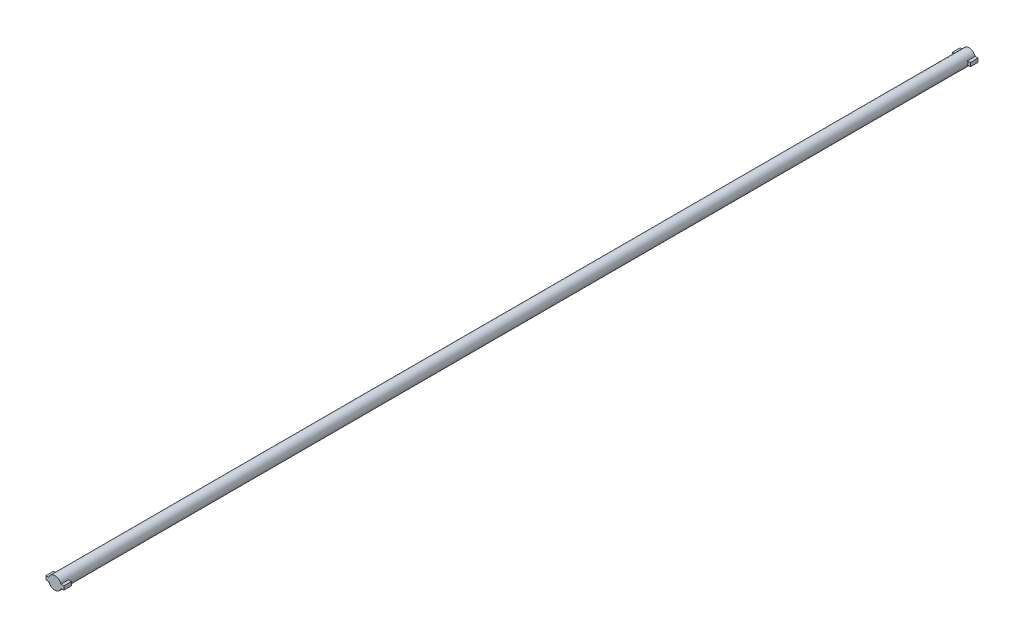
ISO-10303-21;
HEADER;
FILE_DESCRIPTION(('STEP AP214'),'2;1');
FILE_NAME('part.step','',(''),(''),'','','');
FILE_SCHEMA(('AUTOMOTIVE_DESIGN { 1 0 10303 214 1 1 1 1 }'));
ENDSEC;
DATA;
#1=APPLICATION_CONTEXT('core data for automotive mechanical design processes');
#2=APPLICATION_PROTOCOL_DEFINITION('international standard','automotive_design',2000,#1);
#3=PRODUCT_CONTEXT('',#1,'mechanical');
#4=PRODUCT('Part','Part','',(#3));
#5=PRODUCT_RELATED_PRODUCT_CATEGORY('part','',(#4));
#6=PRODUCT_DEFINITION_FORMATION('','',#4);
#7=PRODUCT_DEFINITION_CONTEXT('part definition',#1,'design');
#8=PRODUCT_DEFINITION('design','',#6,#7);
#9=PRODUCT_DEFINITION_SHAPE('','',#8);
#10=(LENGTH_UNIT() NAMED_UNIT(*) SI_UNIT(.MILLI.,.METRE.));
#11=(NAMED_UNIT(*) PLANE_ANGLE_UNIT() SI_UNIT($,.RADIAN.));
#12=(NAMED_UNIT(*) SI_UNIT($,.STERADIAN.) SOLID_ANGLE_UNIT());
#13=UNCERTAINTY_MEASURE_WITH_UNIT(LENGTH_MEASURE(1.E-05),#10,'distance_accuracy_value','');
#14=(GEOMETRIC_REPRESENTATION_CONTEXT(3) GLOBAL_UNCERTAINTY_ASSIGNED_CONTEXT((#13)) GLOBAL_UNIT_ASSIGNED_CONTEXT((#10,
#11,#12)) REPRESENTATION_CONTEXT('',''));
#15=CARTESIAN_POINT('',(0.,0.,0.));
#16=DIRECTION('',(0.,0.,1.));
#17=DIRECTION('',(1.,0.,0.));
#18=AXIS2_PLACEMENT_3D('',#15,#16,#17);
#19=CARTESIAN_POINT('',(0.,0.,457.2));
#20=DIRECTION('',(0.,0.,-1.));
#21=DIRECTION('',(-1.,0.,0.));
#22=AXIS2_PLACEMENT_3D('',#19,#20,#21);
#23=CYLINDRICAL_SURFACE('',#22,3.175);
#24=CARTESIAN_POINT('',(0.,0.,457.2));
#25=DIRECTION('',(0.,0.,1.));
#26=DIRECTION('',(1.,0.,0.));
#27=AXIS2_PLACEMENT_3D('',#24,#25,#26);
#28=CIRCLE('',#27,3.175);
#29=CARTESIAN_POINT('',(-3.0287569644988,-0.9525,457.2));
#30=VERTEX_POINT('',#29);
#31=CARTESIAN_POINT('',(3.0287569644988,-0.9525,457.2));
#32=VERTEX_POINT('',#31);
#33=EDGE_CURVE('E41',#30,#32,#28,.T.);
#34=ORIENTED_EDGE('',*,*,#33,.F.);
#35=DIRECTION('',(0.,0.,1.));
#36=VECTOR('',#35,1.);
#37=CARTESIAN_POINT('',(-3.0287569644988,-0.9525,453.39));
#38=LINE('',#37,#36);
#39=CARTESIAN_POINT('',(-3.0287569644988,-0.9525,453.39));
#40=VERTEX_POINT('',#39);
#41=EDGE_CURVE('E226',#40,#30,#38,.T.);
#42=ORIENTED_EDGE('',*,*,#41,.F.);
#43=CARTESIAN_POINT('',(0.,0.,453.39));
#44=DIRECTION('',(0.,0.,-1.));
#45=DIRECTION('',(-1.,0.,0.));
#46=AXIS2_PLACEMENT_3D('',#43,#44,#45);
#47=CIRCLE('',#46,3.175);
#48=CARTESIAN_POINT('',(-3.0287569644988,0.9525,453.39));
#49=VERTEX_POINT('',#48);
#50=EDGE_CURVE('E216',#40,#49,#47,.T.);
#51=ORIENTED_EDGE('',*,*,#50,.T.);
#52=DIRECTION('',(0.,0.,1.));
#53=VECTOR('',#52,1.);
#54=CARTESIAN_POINT('',(-3.0287569644988,0.9525,453.39));
#55=LINE('',#54,#53);
#56=CARTESIAN_POINT('',(-3.0287569644988,0.9525,457.2));
#57=VERTEX_POINT('',#56);
#58=EDGE_CURVE('E238',#49,#57,#55,.T.);
#59=ORIENTED_EDGE('',*,*,#58,.T.);
#60=CARTESIAN_POINT('',(3.0287569644988,0.9525,457.2));
#61=VERTEX_POINT('',#60);
#62=EDGE_CURVE('E11',#61,#57,#28,.T.);
#63=ORIENTED_EDGE('',*,*,#62,.F.);
#64=DIRECTION('',(0.,0.,1.));
#65=VECTOR('',#64,1.);
#66=CARTESIAN_POINT('',(3.0287569644988,0.9525,453.39));
#67=LINE('',#66,#65);
#68=CARTESIAN_POINT('',(3.0287569644988,0.9525,453.39));
#69=VERTEX_POINT('',#68);
#70=EDGE_CURVE('E256',#69,#61,#67,.T.);
#71=ORIENTED_EDGE('',*,*,#70,.F.);
#72=CARTESIAN_POINT('',(0.,0.,453.39));
#73=DIRECTION('',(0.,0.,-1.));
#74=DIRECTION('',(1.,0.,0.));
#75=AXIS2_PLACEMENT_3D('',#72,#73,#74);
#76=CIRCLE('',#75,3.175);
#77=CARTESIAN_POINT('',(3.0287569644988,-0.9525,453.39));
#78=VERTEX_POINT('',#77);
#79=EDGE_CURVE('E246',#69,#78,#76,.T.);
#80=ORIENTED_EDGE('',*,*,#79,.T.);
#81=DIRECTION('',(0.,0.,1.));
#82=VECTOR('',#81,1.);
#83=CARTESIAN_POINT('',(3.0287569644988,-0.9525,453.39));
#84=LINE('',#83,#82);
#85=EDGE_CURVE('E266',#78,#32,#84,.T.);
#86=ORIENTED_EDGE('',*,*,#85,.T.);
#87=EDGE_LOOP('',(#34,#42,#51,#59,#63,#71,#80,#86));
#88=FACE_BOUND('',#87,.T.);
#89=CARTESIAN_POINT('',(0.,0.,3.80999999999998));
#90=DIRECTION('',(0.,0.,-1.));
#91=DIRECTION('',(-1.,0.,0.));
#92=AXIS2_PLACEMENT_3D('',#89,#90,#91);
#93=CIRCLE('',#92,3.175);
#94=CARTESIAN_POINT('',(-3.0287569644988,-0.9525,3.80999999999998));
#95=VERTEX_POINT('',#94);
#96=CARTESIAN_POINT('',(-3.0287569644988,0.9525,3.80999999999998));
#97=VERTEX_POINT('',#96);
#98=EDGE_CURVE('E48',#95,#97,#93,.T.);
#99=ORIENTED_EDGE('',*,*,#98,.F.);
#100=DIRECTION('',(0.,0.,1.));
#101=VECTOR('',#100,1.);
#102=CARTESIAN_POINT('',(-3.0287569644988,-0.9525,0.));
#103=LINE('',#102,#101);
#104=CARTESIAN_POINT('',(-3.0287569644988,-0.9525,0.));
#105=VERTEX_POINT('',#104);
#106=EDGE_CURVE('E157',#105,#95,#103,.T.);
#107=ORIENTED_EDGE('',*,*,#106,.F.);
#108=CARTESIAN_POINT('',(0.,0.,0.));
#109=DIRECTION('',(0.,0.,1.));
#110=DIRECTION('',(1.,0.,0.));
#111=AXIS2_PLACEMENT_3D('',#108,#109,#110);
#112=CIRCLE('',#111,3.175);
#113=CARTESIAN_POINT('',(3.0287569644988,-0.9525,0.));
#114=VERTEX_POINT('',#113);
#115=EDGE_CURVE('E146',#105,#114,#112,.T.);
#116=ORIENTED_EDGE('',*,*,#115,.T.);
#117=DIRECTION('',(0.,0.,1.));
#118=VECTOR('',#117,1.);
#119=CARTESIAN_POINT('',(3.0287569644988,-0.9525,0.));
#120=LINE('',#119,#118);
#121=CARTESIAN_POINT('',(3.0287569644988,-0.9525,3.80999999999998));
#122=VERTEX_POINT('',#121);
#123=EDGE_CURVE('E209',#114,#122,#120,.T.);
#124=ORIENTED_EDGE('',*,*,#123,.T.);
#125=CARTESIAN_POINT('',(0.,0.,3.80999999999998));
#126=DIRECTION('',(0.,0.,-1.));
#127=DIRECTION('',(1.,0.,0.));
#128=AXIS2_PLACEMENT_3D('',#125,#126,#127);
#129=CIRCLE('',#128,3.175);
#130=CARTESIAN_POINT('',(3.0287569644988,0.9525,3.80999999999998));
#131=VERTEX_POINT('',#130);
#132=EDGE_CURVE('E196',#131,#122,#129,.T.);
#133=ORIENTED_EDGE('',*,*,#132,.F.);
#134=DIRECTION('',(0.,0.,1.));
#135=VECTOR('',#134,1.);
#136=CARTESIAN_POINT('',(3.0287569644988,0.9525,0.));
#137=LINE('',#136,#135);
#138=CARTESIAN_POINT('',(3.0287569644988,0.9525,0.));
#139=VERTEX_POINT('',#138);
#140=EDGE_CURVE('E193',#139,#131,#137,.T.);
#141=ORIENTED_EDGE('',*,*,#140,.F.);
#142=CARTESIAN_POINT('',(-3.0287569644988,0.9525,0.));
#143=VERTEX_POINT('',#142);
#144=EDGE_CURVE('E36',#139,#143,#112,.T.);
#145=ORIENTED_EDGE('',*,*,#144,.T.);
#146=DIRECTION('',(0.,0.,1.));
#147=VECTOR('',#146,1.);
#148=CARTESIAN_POINT('',(-3.0287569644988,0.9525,0.));
#149=LINE('',#148,#147);
#150=EDGE_CURVE('E53',#143,#97,#149,.T.);
#151=ORIENTED_EDGE('',*,*,#150,.T.);
#152=EDGE_LOOP('',(#99,#107,#116,#124,#133,#141,#145,#151));
#153=FACE_BOUND('',#152,.T.);
#154=ADVANCED_FACE('F33',(#88,#153),#23,.T.);
#155=CARTESIAN_POINT('',(0.,0.,457.2));
#156=DIRECTION('',(0.,0.,1.));
#157=DIRECTION('',(1.,0.,0.));
#158=AXIS2_PLACEMENT_3D('',#155,#156,#157);
#159=PLANE('',#158);
#160=ORIENTED_EDGE('',*,*,#62,.T.);
#161=DIRECTION('',(-1.,0.,0.));
#162=VECTOR('',#161,1.);
#163=CARTESIAN_POINT('',(-4.445,0.9525,457.2));
#164=LINE('',#163,#162);
#165=CARTESIAN_POINT('',(-4.445,0.9525,457.2));
#166=VERTEX_POINT('',#165);
#167=EDGE_CURVE('E228',#57,#166,#164,.T.);
#168=ORIENTED_EDGE('',*,*,#167,.T.);
#169=DIRECTION('',(0.,-1.,0.));
#170=VECTOR('',#169,1.);
#171=CARTESIAN_POINT('',(-4.445,-0.9525,457.2));
#172=LINE('',#171,#170);
#173=CARTESIAN_POINT('',(-4.445,-0.9525,457.2));
#174=VERTEX_POINT('',#173);
#175=EDGE_CURVE('E217',#166,#174,#172,.T.);
#176=ORIENTED_EDGE('',*,*,#175,.T.);
#177=DIRECTION('',(1.,0.,0.));
#178=VECTOR('',#177,1.);
#179=CARTESIAN_POINT('',(-4.445,-0.9525,457.2));
#180=LINE('',#179,#178);
#181=EDGE_CURVE('E206',#174,#30,#180,.T.);
#182=ORIENTED_EDGE('',*,*,#181,.T.);
#183=ORIENTED_EDGE('',*,*,#33,.T.);
#184=DIRECTION('',(1.,0.,0.));
#185=VECTOR('',#184,1.);
#186=CARTESIAN_POINT('',(4.445,-0.9525,457.2));
#187=LINE('',#186,#185);
#188=CARTESIAN_POINT('',(4.445,-0.9525,457.2));
#189=VERTEX_POINT('',#188);
#190=EDGE_CURVE('E258',#32,#189,#187,.T.);
#191=ORIENTED_EDGE('',*,*,#190,.T.);
#192=DIRECTION('',(0.,1.,0.));
#193=VECTOR('',#192,1.);
#194=CARTESIAN_POINT('',(4.445,0.9525,457.2));
#195=LINE('',#194,#193);
#196=CARTESIAN_POINT('',(4.445,0.9525,457.2));
#197=VERTEX_POINT('',#196);
#198=EDGE_CURVE('E247',#189,#197,#195,.T.);
#199=ORIENTED_EDGE('',*,*,#198,.T.);
#200=DIRECTION('',(-1.,0.,0.));
#201=VECTOR('',#200,1.);
#202=CARTESIAN_POINT('',(4.445,0.9525,457.2));
#203=LINE('',#202,#201);
#204=EDGE_CURVE('E235',#197,#61,#203,.T.);
#205=ORIENTED_EDGE('',*,*,#204,.T.);
#206=EDGE_LOOP('',(#160,#168,#176,#182,#183,#191,#199,#205));
#207=FACE_BOUND('',#206,.T.);
#208=ADVANCED_FACE('F279',(#207),#159,.T.);
#209=CARTESIAN_POINT('',(0.,0.,0.));
#210=DIRECTION('',(0.,0.,1.));
#211=DIRECTION('',(1.,0.,0.));
#212=AXIS2_PLACEMENT_3D('',#209,#210,#211);
#213=PLANE('',#212);
#214=ORIENTED_EDGE('',*,*,#144,.F.);
#215=DIRECTION('',(-1.,0.,0.));
#216=VECTOR('',#215,1.);
#217=CARTESIAN_POINT('',(4.445,0.9525,0.));
#218=LINE('',#217,#216);
#219=CARTESIAN_POINT('',(4.445,0.9525,0.));
#220=VERTEX_POINT('',#219);
#221=EDGE_CURVE('E185',#220,#139,#218,.T.);
#222=ORIENTED_EDGE('',*,*,#221,.F.);
#223=DIRECTION('',(0.,1.,0.));
#224=VECTOR('',#223,1.);
#225=CARTESIAN_POINT('',(4.445,0.9525,0.));
#226=LINE('',#225,#224);
#227=CARTESIAN_POINT('',(4.445,-0.9525,0.));
#228=VERTEX_POINT('',#227);
#229=EDGE_CURVE('E190',#228,#220,#226,.T.);
#230=ORIENTED_EDGE('',*,*,#229,.F.);
#231=DIRECTION('',(1.,0.,0.));
#232=VECTOR('',#231,1.);
#233=CARTESIAN_POINT('',(4.445,-0.9525,0.));
#234=LINE('',#233,#232);
#235=EDGE_CURVE('E154',#114,#228,#234,.T.);
#236=ORIENTED_EDGE('',*,*,#235,.F.);
#237=ORIENTED_EDGE('',*,*,#115,.F.);
#238=DIRECTION('',(1.,0.,0.));
#239=VECTOR('',#238,1.);
#240=CARTESIAN_POINT('',(-4.445,-0.9525,0.));
#241=LINE('',#240,#239);
#242=CARTESIAN_POINT('',(-4.445,-0.9525,0.));
#243=VERTEX_POINT('',#242);
#244=EDGE_CURVE('E150',#243,#105,#241,.T.);
#245=ORIENTED_EDGE('',*,*,#244,.F.);
#246=DIRECTION('',(0.,-1.,0.));
#247=VECTOR('',#246,1.);
#248=CARTESIAN_POINT('',(-4.445,-0.9525,0.));
#249=LINE('',#248,#247);
#250=CARTESIAN_POINT('',(-4.445,0.9525,0.));
#251=VERTEX_POINT('',#250);
#252=EDGE_CURVE('E161',#251,#243,#249,.T.);
#253=ORIENTED_EDGE('',*,*,#252,.F.);
#254=DIRECTION('',(-1.,0.,0.));
#255=VECTOR('',#254,1.);
#256=CARTESIAN_POINT('',(-4.445,0.9525,0.));
#257=LINE('',#256,#255);
#258=EDGE_CURVE('E165',#143,#251,#257,.T.);
#259=ORIENTED_EDGE('',*,*,#258,.F.);
#260=EDGE_LOOP('',(#214,#222,#230,#236,#237,#245,#253,#259));
#261=FACE_BOUND('',#260,.T.);
#262=ADVANCED_FACE('F147',(#261),#213,.F.);
#263=CARTESIAN_POINT('',(4.445,0.9525,453.39));
#264=DIRECTION('',(0.,1.,0.));
#265=DIRECTION('',(-1.,0.,0.));
#266=AXIS2_PLACEMENT_3D('',#263,#264,#265);
#267=PLANE('',#266);
#268=ORIENTED_EDGE('',*,*,#204,.F.);
#269=DIRECTION('',(0.,0.,1.));
#270=VECTOR('',#269,1.);
#271=CARTESIAN_POINT('',(4.445,0.9525,453.39));
#272=LINE('',#271,#270);
#273=CARTESIAN_POINT('',(4.445,0.9525,453.39));
#274=VERTEX_POINT('',#273);
#275=EDGE_CURVE('E156',#274,#197,#272,.T.);
#276=ORIENTED_EDGE('',*,*,#275,.F.);
#277=DIRECTION('',(-1.,0.,0.));
#278=VECTOR('',#277,1.);
#279=CARTESIAN_POINT('',(4.445,0.9525,453.39));
#280=LINE('',#279,#278);
#281=EDGE_CURVE('E243',#274,#69,#280,.T.);
#282=ORIENTED_EDGE('',*,*,#281,.T.);
#283=ORIENTED_EDGE('',*,*,#70,.T.);
#284=EDGE_LOOP('',(#268,#276,#282,#283));
#285=FACE_BOUND('',#284,.T.);
#286=ADVANCED_FACE('F274',(#285),#267,.T.);
#287=CARTESIAN_POINT('',(4.445,0.9525,453.39));
#288=DIRECTION('',(1.,0.,0.));
#289=DIRECTION('',(0.,0.,-1.));
#290=AXIS2_PLACEMENT_3D('',#287,#288,#289);
#291=PLANE('',#290);
#292=ORIENTED_EDGE('',*,*,#198,.F.);
#293=DIRECTION('',(0.,0.,1.));
#294=VECTOR('',#293,1.);
#295=CARTESIAN_POINT('',(4.445,-0.9525,453.39));
#296=LINE('',#295,#294);
#297=CARTESIAN_POINT('',(4.445,-0.9525,453.39));
#298=VERTEX_POINT('',#297);
#299=EDGE_CURVE('E264',#298,#189,#296,.T.);
#300=ORIENTED_EDGE('',*,*,#299,.F.);
#301=DIRECTION('',(0.,1.,0.));
#302=VECTOR('',#301,1.);
#303=CARTESIAN_POINT('',(4.445,0.9525,453.39));
#304=LINE('',#303,#302);
#305=EDGE_CURVE('E253',#298,#274,#304,.T.);
#306=ORIENTED_EDGE('',*,*,#305,.T.);
#307=ORIENTED_EDGE('',*,*,#275,.T.);
#308=EDGE_LOOP('',(#292,#300,#306,#307));
#309=FACE_BOUND('',#308,.T.);
#310=ADVANCED_FACE('F284',(#309),#291,.T.);
#311=CARTESIAN_POINT('',(4.445,-0.9525,453.39));
#312=DIRECTION('',(0.,-1.,0.));
#313=DIRECTION('',(1.,0.,0.));
#314=AXIS2_PLACEMENT_3D('',#311,#312,#313);
#315=PLANE('',#314);
#316=ORIENTED_EDGE('',*,*,#190,.F.);
#317=ORIENTED_EDGE('',*,*,#85,.F.);
#318=DIRECTION('',(1.,0.,0.));
#319=VECTOR('',#318,1.);
#320=CARTESIAN_POINT('',(4.445,-0.9525,453.39));
#321=LINE('',#320,#319);
#322=EDGE_CURVE('E250',#78,#298,#321,.T.);
#323=ORIENTED_EDGE('',*,*,#322,.T.);
#324=ORIENTED_EDGE('',*,*,#299,.T.);
#325=EDGE_LOOP('',(#316,#317,#323,#324));
#326=FACE_BOUND('',#325,.T.);
#327=ADVANCED_FACE('F291',(#326),#315,.T.);
#328=CARTESIAN_POINT('',(0.,0.,453.39));
#329=DIRECTION('',(0.,0.,1.));
#330=DIRECTION('',(1.,0.,0.));
#331=AXIS2_PLACEMENT_3D('',#328,#329,#330);
#332=PLANE('',#331);
#333=ORIENTED_EDGE('',*,*,#281,.F.);
#334=ORIENTED_EDGE('',*,*,#305,.F.);
#335=ORIENTED_EDGE('',*,*,#322,.F.);
#336=ORIENTED_EDGE('',*,*,#79,.F.);
#337=EDGE_LOOP('',(#333,#334,#335,#336));
#338=FACE_BOUND('',#337,.T.);
#339=ADVANCED_FACE('F287',(#338),#332,.F.);
#340=CARTESIAN_POINT('',(-4.445,-0.9525,453.39));
#341=DIRECTION('',(0.,-1.,0.));
#342=DIRECTION('',(1.,0.,0.));
#343=AXIS2_PLACEMENT_3D('',#340,#341,#342);
#344=PLANE('',#343);
#345=ORIENTED_EDGE('',*,*,#181,.F.);
#346=DIRECTION('',(0.,0.,1.));
#347=VECTOR('',#346,1.);
#348=CARTESIAN_POINT('',(-4.445,-0.9525,453.39));
#349=LINE('',#348,#347);
#350=CARTESIAN_POINT('',(-4.445,-0.9525,453.39));
#351=VERTEX_POINT('',#350);
#352=EDGE_CURVE('E233',#351,#174,#349,.T.);
#353=ORIENTED_EDGE('',*,*,#352,.F.);
#354=DIRECTION('',(1.,0.,0.));
#355=VECTOR('',#354,1.);
#356=CARTESIAN_POINT('',(-4.445,-0.9525,453.39));
#357=LINE('',#356,#355);
#358=EDGE_CURVE('E213',#351,#40,#357,.T.);
#359=ORIENTED_EDGE('',*,*,#358,.T.);
#360=ORIENTED_EDGE('',*,*,#41,.T.);
#361=EDGE_LOOP('',(#345,#353,#359,#360));
#362=FACE_BOUND('',#361,.T.);
#363=ADVANCED_FACE('F298',(#362),#344,.T.);
#364=CARTESIAN_POINT('',(-4.445,-0.9525,453.39));
#365=DIRECTION('',(-1.,0.,0.));
#366=DIRECTION('',(0.,0.,1.));
#367=AXIS2_PLACEMENT_3D('',#364,#365,#366);
#368=PLANE('',#367);
#369=ORIENTED_EDGE('',*,*,#175,.F.);
#370=DIRECTION('',(0.,0.,1.));
#371=VECTOR('',#370,1.);
#372=CARTESIAN_POINT('',(-4.445,0.9525,453.39));
#373=LINE('',#372,#371);
#374=CARTESIAN_POINT('',(-4.445,0.9525,453.39));
#375=VERTEX_POINT('',#374);
#376=EDGE_CURVE('E236',#375,#166,#373,.T.);
#377=ORIENTED_EDGE('',*,*,#376,.F.);
#378=DIRECTION('',(0.,-1.,0.));
#379=VECTOR('',#378,1.);
#380=CARTESIAN_POINT('',(-4.445,-0.9525,453.39));
#381=LINE('',#380,#379);
#382=EDGE_CURVE('E223',#375,#351,#381,.T.);
#383=ORIENTED_EDGE('',*,*,#382,.T.);
#384=ORIENTED_EDGE('',*,*,#352,.T.);
#385=EDGE_LOOP('',(#369,#377,#383,#384));
#386=FACE_BOUND('',#385,.T.);
#387=ADVANCED_FACE('F343',(#386),#368,.T.);
#388=CARTESIAN_POINT('',(-4.445,0.9525,453.39));
#389=DIRECTION('',(0.,1.,0.));
#390=DIRECTION('',(-1.,0.,0.));
#391=AXIS2_PLACEMENT_3D('',#388,#389,#390);
#392=PLANE('',#391);
#393=ORIENTED_EDGE('',*,*,#167,.F.);
#394=ORIENTED_EDGE('',*,*,#58,.F.);
#395=DIRECTION('',(-1.,0.,0.));
#396=VECTOR('',#395,1.);
#397=CARTESIAN_POINT('',(-4.445,0.9525,453.39));
#398=LINE('',#397,#396);
#399=EDGE_CURVE('E220',#49,#375,#398,.T.);
#400=ORIENTED_EDGE('',*,*,#399,.T.);
#401=ORIENTED_EDGE('',*,*,#376,.T.);
#402=EDGE_LOOP('',(#393,#394,#400,#401));
#403=FACE_BOUND('',#402,.T.);
#404=ADVANCED_FACE('F353',(#403),#392,.T.);
#405=CARTESIAN_POINT('',(0.,0.,453.39));
#406=DIRECTION('',(0.,0.,1.));
#407=DIRECTION('',(-1.,0.,0.));
#408=AXIS2_PLACEMENT_3D('',#405,#406,#407);
#409=PLANE('',#408);
#410=ORIENTED_EDGE('',*,*,#358,.F.);
#411=ORIENTED_EDGE('',*,*,#382,.F.);
#412=ORIENTED_EDGE('',*,*,#399,.F.);
#413=ORIENTED_EDGE('',*,*,#50,.F.);
#414=EDGE_LOOP('',(#410,#411,#412,#413));
#415=FACE_BOUND('',#414,.T.);
#416=ADVANCED_FACE('F363',(#415),#409,.F.);
#417=CARTESIAN_POINT('',(4.445,0.9525,0.));
#418=DIRECTION('',(0.,1.,0.));
#419=DIRECTION('',(-1.,0.,0.));
#420=AXIS2_PLACEMENT_3D('',#417,#418,#419);
#421=PLANE('',#420);
#422=DIRECTION('',(-1.,0.,0.));
#423=VECTOR('',#422,1.);
#424=CARTESIAN_POINT('',(4.445,0.9525,3.80999999999998));
#425=LINE('',#424,#423);
#426=CARTESIAN_POINT('',(4.445,0.9525,3.80999999999998));
#427=VERTEX_POINT('',#426);
#428=EDGE_CURVE('E181',#427,#131,#425,.T.);
#429=ORIENTED_EDGE('',*,*,#428,.F.);
#430=DIRECTION('',(0.,0.,1.));
#431=VECTOR('',#430,1.);
#432=CARTESIAN_POINT('',(4.445,0.9525,0.));
#433=LINE('',#432,#431);
#434=EDGE_CURVE('E204',#220,#427,#433,.T.);
#435=ORIENTED_EDGE('',*,*,#434,.F.);
#436=ORIENTED_EDGE('',*,*,#221,.T.);
#437=ORIENTED_EDGE('',*,*,#140,.T.);
#438=EDGE_LOOP('',(#429,#435,#436,#437));
#439=FACE_BOUND('',#438,.T.);
#440=ADVANCED_FACE('F372',(#439),#421,.T.);
#441=CARTESIAN_POINT('',(4.445,0.9525,0.));
#442=DIRECTION('',(1.,0.,0.));
#443=DIRECTION('',(0.,0.,-1.));
#444=AXIS2_PLACEMENT_3D('',#441,#442,#443);
#445=PLANE('',#444);
#446=DIRECTION('',(0.,1.,0.));
#447=VECTOR('',#446,1.);
#448=CARTESIAN_POINT('',(4.445,0.9525,3.80999999999998));
#449=LINE('',#448,#447);
#450=CARTESIAN_POINT('',(4.445,-0.9525,3.80999999999998));
#451=VERTEX_POINT('',#450);
#452=EDGE_CURVE('E188',#451,#427,#449,.T.);
#453=ORIENTED_EDGE('',*,*,#452,.F.);
#454=DIRECTION('',(0.,0.,1.));
#455=VECTOR('',#454,1.);
#456=CARTESIAN_POINT('',(4.445,-0.9525,0.));
#457=LINE('',#456,#455);
#458=EDGE_CURVE('E207',#228,#451,#457,.T.);
#459=ORIENTED_EDGE('',*,*,#458,.F.);
#460=ORIENTED_EDGE('',*,*,#229,.T.);
#461=ORIENTED_EDGE('',*,*,#434,.T.);
#462=EDGE_LOOP('',(#453,#459,#460,#461));
#463=FACE_BOUND('',#462,.T.);
#464=ADVANCED_FACE('F393',(#463),#445,.T.);
#465=CARTESIAN_POINT('',(4.445,-0.9525,0.));
#466=DIRECTION('',(0.,-1.,0.));
#467=DIRECTION('',(1.,0.,0.));
#468=AXIS2_PLACEMENT_3D('',#465,#466,#467);
#469=PLANE('',#468);
#470=DIRECTION('',(1.,0.,0.));
#471=VECTOR('',#470,1.);
#472=CARTESIAN_POINT('',(4.445,-0.9525,3.80999999999998));
#473=LINE('',#472,#471);
#474=EDGE_CURVE('E199',#122,#451,#473,.T.);
#475=ORIENTED_EDGE('',*,*,#474,.F.);
#476=ORIENTED_EDGE('',*,*,#123,.F.);
#477=ORIENTED_EDGE('',*,*,#235,.T.);
#478=ORIENTED_EDGE('',*,*,#458,.T.);
#479=EDGE_LOOP('',(#475,#476,#477,#478));
#480=FACE_BOUND('',#479,.T.);
#481=ADVANCED_FACE('F403',(#480),#469,.T.);
#482=CARTESIAN_POINT('',(0.,0.,3.80999999999998));
#483=DIRECTION('',(0.,0.,1.));
#484=DIRECTION('',(1.,0.,0.));
#485=AXIS2_PLACEMENT_3D('',#482,#483,#484);
#486=PLANE('',#485);
#487=ORIENTED_EDGE('',*,*,#428,.T.);
#488=ORIENTED_EDGE('',*,*,#132,.T.);
#489=ORIENTED_EDGE('',*,*,#474,.T.);
#490=ORIENTED_EDGE('',*,*,#452,.T.);
#491=EDGE_LOOP('',(#487,#488,#489,#490));
#492=FACE_BOUND('',#491,.T.);
#493=ADVANCED_FACE('F413',(#492),#486,.T.);
#494=CARTESIAN_POINT('',(-4.445,-0.9525,0.));
#495=DIRECTION('',(0.,-1.,0.));
#496=DIRECTION('',(1.,0.,0.));
#497=AXIS2_PLACEMENT_3D('',#494,#495,#496);
#498=PLANE('',#497);
#499=DIRECTION('',(1.,0.,0.));
#500=VECTOR('',#499,1.);
#501=CARTESIAN_POINT('',(-4.445,-0.9525,3.80999999999998));
#502=LINE('',#501,#500);
#503=CARTESIAN_POINT('',(-4.445,-0.9525,3.80999999999998));
#504=VERTEX_POINT('',#503);
#505=EDGE_CURVE('E175',#504,#95,#502,.T.);
#506=ORIENTED_EDGE('',*,*,#505,.F.);
#507=DIRECTION('',(0.,0.,1.));
#508=VECTOR('',#507,1.);
#509=CARTESIAN_POINT('',(-4.445,-0.9525,0.));
#510=LINE('',#509,#508);
#511=EDGE_CURVE('E164',#243,#504,#510,.T.);
#512=ORIENTED_EDGE('',*,*,#511,.F.);
#513=ORIENTED_EDGE('',*,*,#244,.T.);
#514=ORIENTED_EDGE('',*,*,#106,.T.);
#515=EDGE_LOOP('',(#506,#512,#513,#514));
#516=FACE_BOUND('',#515,.T.);
#517=ADVANCED_FACE('F163',(#516),#498,.T.);
#518=CARTESIAN_POINT('',(-4.445,-0.9525,0.));
#519=DIRECTION('',(-1.,0.,0.));
#520=DIRECTION('',(0.,0.,1.));
#521=AXIS2_PLACEMENT_3D('',#518,#519,#520);
#522=PLANE('',#521);
#523=DIRECTION('',(0.,-1.,0.));
#524=VECTOR('',#523,1.);
#525=CARTESIAN_POINT('',(-4.445,-0.9525,3.80999999999998));
#526=LINE('',#525,#524);
#527=CARTESIAN_POINT('',(-4.445,0.9525,3.80999999999998));
#528=VERTEX_POINT('',#527);
#529=EDGE_CURVE('E166',#528,#504,#526,.T.);
#530=ORIENTED_EDGE('',*,*,#529,.F.);
#531=DIRECTION('',(0.,0.,1.));
#532=VECTOR('',#531,1.);
#533=CARTESIAN_POINT('',(-4.445,0.9525,0.));
#534=LINE('',#533,#532);
#535=EDGE_CURVE('E182',#251,#528,#534,.T.);
#536=ORIENTED_EDGE('',*,*,#535,.F.);
#537=ORIENTED_EDGE('',*,*,#252,.T.);
#538=ORIENTED_EDGE('',*,*,#511,.T.);
#539=EDGE_LOOP('',(#530,#536,#537,#538));
#540=FACE_BOUND('',#539,.T.);
#541=ADVANCED_FACE('F432',(#540),#522,.T.);
#542=CARTESIAN_POINT('',(-4.445,0.9525,0.));
#543=DIRECTION('',(0.,1.,0.));
#544=DIRECTION('',(-1.,0.,0.));
#545=AXIS2_PLACEMENT_3D('',#542,#543,#544);
#546=PLANE('',#545);
#547=DIRECTION('',(-1.,0.,0.));
#548=VECTOR('',#547,1.);
#549=CARTESIAN_POINT('',(-4.445,0.9525,3.80999999999998));
#550=LINE('',#549,#548);
#551=EDGE_CURVE('E171',#97,#528,#550,.T.);
#552=ORIENTED_EDGE('',*,*,#551,.F.);
#553=ORIENTED_EDGE('',*,*,#150,.F.);
#554=ORIENTED_EDGE('',*,*,#258,.T.);
#555=ORIENTED_EDGE('',*,*,#535,.T.);
#556=EDGE_LOOP('',(#552,#553,#554,#555));
#557=FACE_BOUND('',#556,.T.);
#558=ADVANCED_FACE('F441',(#557),#546,.T.);
#559=CARTESIAN_POINT('',(0.,0.,3.80999999999998));
#560=DIRECTION('',(0.,0.,1.));
#561=DIRECTION('',(-1.,0.,0.));
#562=AXIS2_PLACEMENT_3D('',#559,#560,#561);
#563=PLANE('',#562);
#564=ORIENTED_EDGE('',*,*,#505,.T.);
#565=ORIENTED_EDGE('',*,*,#98,.T.);
#566=ORIENTED_EDGE('',*,*,#551,.T.);
#567=ORIENTED_EDGE('',*,*,#529,.T.);
#568=EDGE_LOOP('',(#564,#565,#566,#567));
#569=FACE_BOUND('',#568,.T.);
#570=ADVANCED_FACE('F451',(#569),#563,.T.);
#571=CLOSED_SHELL('',(#154,#208,#262,#286,#310,#327,#339,#363,#387,#404,#416,#440,#464,#481,
#493,#517,#541,#558,#570));
#572=MANIFOLD_SOLID_BREP('B2',#571);
#573=ADVANCED_BREP_SHAPE_REPRESENTATION('',(#18,#572),#14);
#574=SHAPE_DEFINITION_REPRESENTATION(#9,#573);
ENDSEC;
END-ISO-10303-21;
